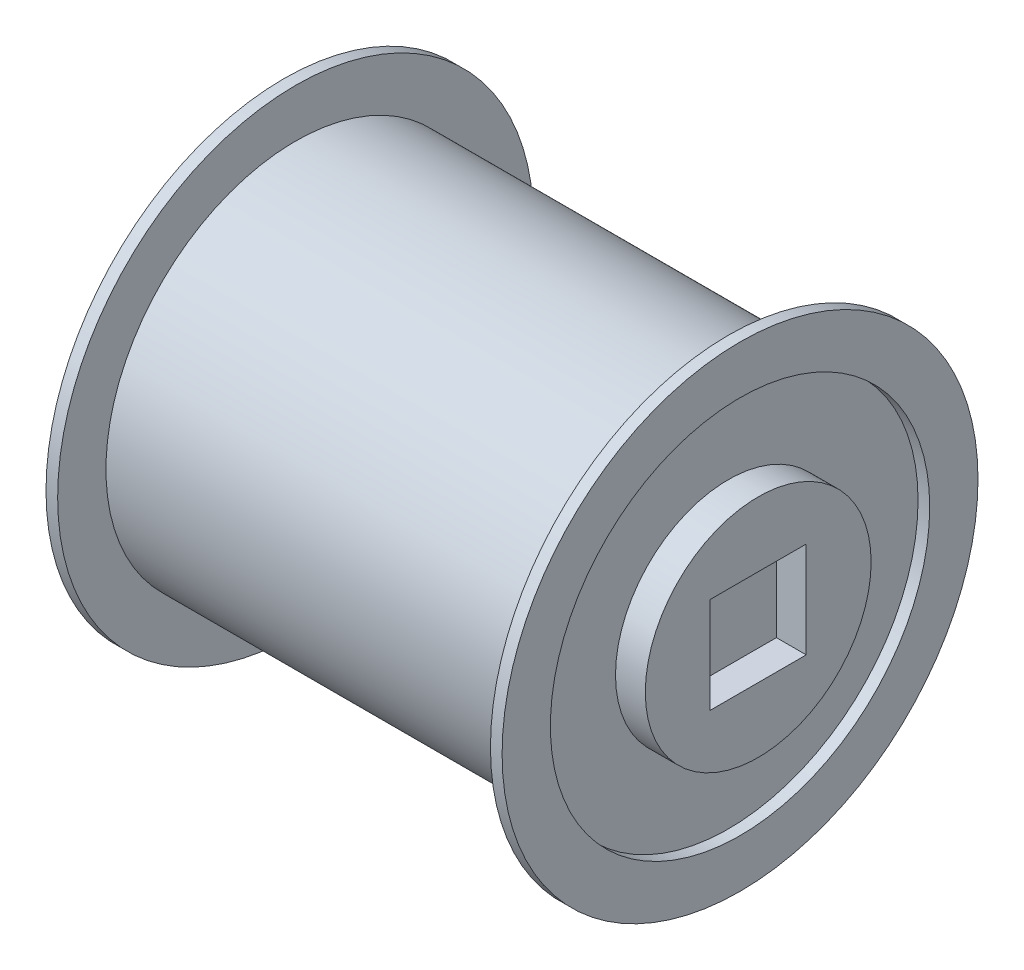
ISO-10303-21;
HEADER;
FILE_DESCRIPTION(('STEP AP214'),'2;1');
FILE_NAME('part.step','',(''),(''),'','','');
FILE_SCHEMA(('AUTOMOTIVE_DESIGN { 1 0 10303 214 1 1 1 1 }'));
ENDSEC;
DATA;
#1=APPLICATION_CONTEXT('core data for automotive mechanical design processes');
#2=APPLICATION_PROTOCOL_DEFINITION('international standard','automotive_design',2000,#1);
#3=PRODUCT_CONTEXT('',#1,'mechanical');
#4=PRODUCT('Part','Part','',(#3));
#5=PRODUCT_RELATED_PRODUCT_CATEGORY('part','',(#4));
#6=PRODUCT_DEFINITION_FORMATION('','',#4);
#7=PRODUCT_DEFINITION_CONTEXT('part definition',#1,'design');
#8=PRODUCT_DEFINITION('design','',#6,#7);
#9=PRODUCT_DEFINITION_SHAPE('','',#8);
#10=(LENGTH_UNIT() NAMED_UNIT(*) SI_UNIT(.MILLI.,.METRE.));
#11=(NAMED_UNIT(*) PLANE_ANGLE_UNIT() SI_UNIT($,.RADIAN.));
#12=(NAMED_UNIT(*) SI_UNIT($,.STERADIAN.) SOLID_ANGLE_UNIT());
#13=UNCERTAINTY_MEASURE_WITH_UNIT(LENGTH_MEASURE(1.E-05),#10,'distance_accuracy_value','');
#14=(GEOMETRIC_REPRESENTATION_CONTEXT(3) GLOBAL_UNCERTAINTY_ASSIGNED_CONTEXT((#13)) GLOBAL_UNIT_ASSIGNED_CONTEXT((#10,
#11,#12)) REPRESENTATION_CONTEXT('',''));
#15=CARTESIAN_POINT('',(0.,0.,0.));
#16=DIRECTION('',(0.,0.,1.));
#17=DIRECTION('',(1.,0.,0.));
#18=AXIS2_PLACEMENT_3D('',#15,#16,#17);
#19=CARTESIAN_POINT('',(37.15,0.,0.));
#20=DIRECTION('',(1.,0.,0.));
#21=DIRECTION('',(0.,0.,-1.));
#22=AXIS2_PLACEMENT_3D('',#19,#20,#21);
#23=CYLINDRICAL_SURFACE('',#22,20.425);
#24=CARTESIAN_POINT('',(37.15,0.,0.));
#25=DIRECTION('',(1.,0.,0.));
#26=DIRECTION('',(0.,0.,-1.));
#27=AXIS2_PLACEMENT_3D('',#24,#25,#26);
#28=CIRCLE('',#27,20.425);
#29=CARTESIAN_POINT('',(37.15,0.,-20.425));
#30=VERTEX_POINT('',#29);
#31=EDGE_CURVE('E12',#30,#30,#28,.T.);
#32=ORIENTED_EDGE('',*,*,#31,.T.);
#33=EDGE_LOOP('',(#32));
#34=FACE_BOUND('',#33,.T.);
#35=CARTESIAN_POINT('',(38.15,0.,0.));
#36=DIRECTION('',(1.,0.,0.));
#37=DIRECTION('',(0.,0.,-1.));
#38=AXIS2_PLACEMENT_3D('',#35,#36,#37);
#39=CIRCLE('',#38,20.425);
#40=CARTESIAN_POINT('',(38.15,0.,-20.425));
#41=VERTEX_POINT('',#40);
#42=EDGE_CURVE('E129',#41,#41,#39,.T.);
#43=ORIENTED_EDGE('',*,*,#42,.F.);
#44=EDGE_LOOP('',(#43));
#45=FACE_BOUND('',#44,.T.);
#46=ADVANCED_FACE('F126',(#34,#45),#23,.T.);
#47=CARTESIAN_POINT('',(37.15,0.,0.));
#48=DIRECTION('',(1.,0.,0.));
#49=DIRECTION('',(0.,0.,-1.));
#50=AXIS2_PLACEMENT_3D('',#47,#48,#49);
#51=PLANE('',#50);
#52=CARTESIAN_POINT('',(37.15,0.,0.));
#53=DIRECTION('',(1.,0.,0.));
#54=DIRECTION('',(0.,0.,-1.));
#55=AXIS2_PLACEMENT_3D('',#52,#53,#54);
#56=CIRCLE('',#55,16.28);
#57=CARTESIAN_POINT('',(37.15,0.,-16.28));
#58=VERTEX_POINT('',#57);
#59=EDGE_CURVE('E136',#58,#58,#56,.T.);
#60=ORIENTED_EDGE('',*,*,#59,.T.);
#61=EDGE_LOOP('',(#60));
#62=FACE_BOUND('',#61,.T.);
#63=ORIENTED_EDGE('',*,*,#31,.F.);
#64=EDGE_LOOP('',(#63));
#65=FACE_BOUND('',#64,.T.);
#66=ADVANCED_FACE('F144',(#62,#65),#51,.F.);
#67=CARTESIAN_POINT('',(38.15,0.,0.));
#68=DIRECTION('',(1.,0.,0.));
#69=DIRECTION('',(0.,0.,-1.));
#70=AXIS2_PLACEMENT_3D('',#67,#68,#69);
#71=PLANE('',#70);
#72=CARTESIAN_POINT('',(38.15,0.,0.));
#73=DIRECTION('',(1.,0.,0.));
#74=DIRECTION('',(0.,0.,-1.));
#75=AXIS2_PLACEMENT_3D('',#72,#73,#74);
#76=CIRCLE('',#75,16.28);
#77=CARTESIAN_POINT('',(38.15,0.,-16.28));
#78=VERTEX_POINT('',#77);
#79=EDGE_CURVE('E138',#78,#78,#76,.T.);
#80=ORIENTED_EDGE('',*,*,#79,.F.);
#81=EDGE_LOOP('',(#80));
#82=FACE_BOUND('',#81,.T.);
#83=ORIENTED_EDGE('',*,*,#42,.T.);
#84=EDGE_LOOP('',(#83));
#85=FACE_BOUND('',#84,.T.);
#86=ADVANCED_FACE('F150',(#82,#85),#71,.T.);
#87=CARTESIAN_POINT('',(37.15,0.,0.));
#88=DIRECTION('',(1.,0.,0.));
#89=DIRECTION('',(0.,0.,-1.));
#90=AXIS2_PLACEMENT_3D('',#87,#88,#89);
#91=CYLINDRICAL_SURFACE('',#90,16.28);
#92=ORIENTED_EDGE('',*,*,#59,.F.);
#93=EDGE_LOOP('',(#92));
#94=FACE_BOUND('',#93,.T.);
#95=ORIENTED_EDGE('',*,*,#79,.T.);
#96=EDGE_LOOP('',(#95));
#97=FACE_BOUND('',#96,.T.);
#98=ADVANCED_FACE('F147',(#94,#97),#91,.F.);
#99=CLOSED_SHELL('',(#46,#66,#86,#98));
#100=MANIFOLD_SOLID_BREP('B2',#99);
#101=CARTESIAN_POINT('',(-1.,0.,0.));
#102=DIRECTION('',(1.,0.,0.));
#103=DIRECTION('',(0.,0.,-1.));
#104=AXIS2_PLACEMENT_3D('',#101,#102,#103);
#105=CYLINDRICAL_SURFACE('',#104,20.425);
#106=CARTESIAN_POINT('',(-1.,0.,0.));
#107=DIRECTION('',(1.,0.,0.));
#108=DIRECTION('',(0.,0.,-1.));
#109=AXIS2_PLACEMENT_3D('',#106,#107,#108);
#110=CIRCLE('',#109,20.425);
#111=CARTESIAN_POINT('',(-1.,0.,-20.425));
#112=VERTEX_POINT('',#111);
#113=EDGE_CURVE('E125',#112,#112,#110,.T.);
#114=ORIENTED_EDGE('',*,*,#113,.T.);
#115=EDGE_LOOP('',(#114));
#116=FACE_BOUND('',#115,.T.);
#117=CARTESIAN_POINT('',(0.,0.,0.));
#118=DIRECTION('',(1.,0.,0.));
#119=DIRECTION('',(0.,0.,-1.));
#120=AXIS2_PLACEMENT_3D('',#117,#118,#119);
#121=CIRCLE('',#120,20.425);
#122=CARTESIAN_POINT('',(0.,0.,-20.425));
#123=VERTEX_POINT('',#122);
#124=EDGE_CURVE('E200',#123,#123,#121,.T.);
#125=ORIENTED_EDGE('',*,*,#124,.F.);
#126=EDGE_LOOP('',(#125));
#127=FACE_BOUND('',#126,.T.);
#128=ADVANCED_FACE('F197',(#116,#127),#105,.T.);
#129=CARTESIAN_POINT('',(-1.,0.,0.));
#130=DIRECTION('',(1.,0.,0.));
#131=DIRECTION('',(0.,0.,-1.));
#132=AXIS2_PLACEMENT_3D('',#129,#130,#131);
#133=PLANE('',#132);
#134=CARTESIAN_POINT('',(-1.,0.,0.));
#135=DIRECTION('',(1.,0.,0.));
#136=DIRECTION('',(0.,0.,-1.));
#137=AXIS2_PLACEMENT_3D('',#134,#135,#136);
#138=CIRCLE('',#137,16.28);
#139=CARTESIAN_POINT('',(-1.,0.,-16.28));
#140=VERTEX_POINT('',#139);
#141=EDGE_CURVE('E207',#140,#140,#138,.T.);
#142=ORIENTED_EDGE('',*,*,#141,.T.);
#143=EDGE_LOOP('',(#142));
#144=FACE_BOUND('',#143,.T.);
#145=ORIENTED_EDGE('',*,*,#113,.F.);
#146=EDGE_LOOP('',(#145));
#147=FACE_BOUND('',#146,.T.);
#148=ADVANCED_FACE('F215',(#144,#147),#133,.F.);
#149=CARTESIAN_POINT('',(0.,0.,0.));
#150=DIRECTION('',(1.,0.,0.));
#151=DIRECTION('',(0.,0.,-1.));
#152=AXIS2_PLACEMENT_3D('',#149,#150,#151);
#153=PLANE('',#152);
#154=CARTESIAN_POINT('',(0.,0.,0.));
#155=DIRECTION('',(1.,0.,0.));
#156=DIRECTION('',(0.,0.,-1.));
#157=AXIS2_PLACEMENT_3D('',#154,#155,#156);
#158=CIRCLE('',#157,16.28);
#159=CARTESIAN_POINT('',(0.,0.,-16.28));
#160=VERTEX_POINT('',#159);
#161=EDGE_CURVE('E209',#160,#160,#158,.T.);
#162=ORIENTED_EDGE('',*,*,#161,.F.);
#163=EDGE_LOOP('',(#162));
#164=FACE_BOUND('',#163,.T.);
#165=ORIENTED_EDGE('',*,*,#124,.T.);
#166=EDGE_LOOP('',(#165));
#167=FACE_BOUND('',#166,.T.);
#168=ADVANCED_FACE('F221',(#164,#167),#153,.T.);
#169=CARTESIAN_POINT('',(-1.,0.,0.));
#170=DIRECTION('',(1.,0.,0.));
#171=DIRECTION('',(0.,0.,-1.));
#172=AXIS2_PLACEMENT_3D('',#169,#170,#171);
#173=CYLINDRICAL_SURFACE('',#172,16.28);
#174=ORIENTED_EDGE('',*,*,#141,.F.);
#175=EDGE_LOOP('',(#174));
#176=FACE_BOUND('',#175,.T.);
#177=ORIENTED_EDGE('',*,*,#161,.T.);
#178=EDGE_LOOP('',(#177));
#179=FACE_BOUND('',#178,.T.);
#180=ADVANCED_FACE('F218',(#176,#179),#173,.F.);
#181=CLOSED_SHELL('',(#128,#148,#168,#180));
#182=MANIFOLD_SOLID_BREP('B7',#181);
#183=CARTESIAN_POINT('',(39.71,4.12030856,-4.12030856));
#184=DIRECTION('',(0.,-1.,0.));
#185=DIRECTION('',(0.,0.,-1.));
#186=AXIS2_PLACEMENT_3D('',#183,#184,#185);
#187=PLANE('',#186);
#188=DIRECTION('',(-1.,0.,0.));
#189=VECTOR('',#188,1.);
#190=CARTESIAN_POINT('',(39.71,4.12030856,4.12030856));
#191=LINE('',#190,#189);
#192=CARTESIAN_POINT('',(39.71,4.12030856,4.12030856));
#193=VERTEX_POINT('',#192);
#194=CARTESIAN_POINT('',(37.15,4.12030856,4.12030856));
#195=VERTEX_POINT('',#194);
#196=EDGE_CURVE('E343',#193,#195,#191,.T.);
#197=ORIENTED_EDGE('',*,*,#196,.T.);
#198=DIRECTION('',(0.,0.,1.));
#199=VECTOR('',#198,1.);
#200=CARTESIAN_POINT('',(37.15,4.12030856,-4.12030856));
#201=LINE('',#200,#199);
#202=CARTESIAN_POINT('',(37.15,4.12030856,-4.12030856));
#203=VERTEX_POINT('',#202);
#204=EDGE_CURVE('E342',#203,#195,#201,.T.);
#205=ORIENTED_EDGE('',*,*,#204,.F.);
#206=DIRECTION('',(-1.,0.,0.));
#207=VECTOR('',#206,1.);
#208=CARTESIAN_POINT('',(39.71,4.12030856,-4.12030856));
#209=LINE('',#208,#207);
#210=CARTESIAN_POINT('',(39.71,4.12030856,-4.12030856));
#211=VERTEX_POINT('',#210);
#212=EDGE_CURVE('E327',#211,#203,#209,.T.);
#213=ORIENTED_EDGE('',*,*,#212,.F.);
#214=DIRECTION('',(0.,0.,1.));
#215=VECTOR('',#214,1.);
#216=CARTESIAN_POINT('',(39.71,4.12030856,-4.12030856));
#217=LINE('',#216,#215);
#218=EDGE_CURVE('E392',#211,#193,#217,.T.);
#219=ORIENTED_EDGE('',*,*,#218,.T.);
#220=EDGE_LOOP('',(#197,#205,#213,#219));
#221=FACE_BOUND('',#220,.T.);
#222=ADVANCED_FACE('F259',(#221),#187,.T.);
#223=CARTESIAN_POINT('',(39.71,4.12030856,4.12030856));
#224=DIRECTION('',(0.,0.,-1.));
#225=DIRECTION('',(-1.,0.,0.));
#226=AXIS2_PLACEMENT_3D('',#223,#224,#225);
#227=PLANE('',#226);
#228=DIRECTION('',(-1.,0.,0.));
#229=VECTOR('',#228,1.);
#230=CARTESIAN_POINT('',(39.71,-4.12030856,4.12030856));
#231=LINE('',#230,#229);
#232=CARTESIAN_POINT('',(39.71,-4.12030856,4.12030856));
#233=VERTEX_POINT('',#232);
#234=CARTESIAN_POINT('',(37.15,-4.12030856,4.12030856));
#235=VERTEX_POINT('',#234);
#236=EDGE_CURVE('E408',#233,#235,#231,.T.);
#237=ORIENTED_EDGE('',*,*,#236,.T.);
#238=DIRECTION('',(0.,-1.,0.));
#239=VECTOR('',#238,1.);
#240=CARTESIAN_POINT('',(37.15,4.12030856,4.12030856));
#241=LINE('',#240,#239);
#242=EDGE_CURVE('E275',#195,#235,#241,.T.);
#243=ORIENTED_EDGE('',*,*,#242,.F.);
#244=ORIENTED_EDGE('',*,*,#196,.F.);
#245=DIRECTION('',(0.,-1.,0.));
#246=VECTOR('',#245,1.);
#247=CARTESIAN_POINT('',(39.71,4.12030856,4.12030856));
#248=LINE('',#247,#246);
#249=EDGE_CURVE('E395',#193,#233,#248,.T.);
#250=ORIENTED_EDGE('',*,*,#249,.T.);
#251=EDGE_LOOP('',(#237,#243,#244,#250));
#252=FACE_BOUND('',#251,.T.);
#253=ADVANCED_FACE('F434',(#252),#227,.T.);
#254=CARTESIAN_POINT('',(39.71,-4.12030856,-4.12030856));
#255=DIRECTION('',(0.,-1.,0.));
#256=DIRECTION('',(0.,0.,-1.));
#257=AXIS2_PLACEMENT_3D('',#254,#255,#256);
#258=PLANE('',#257);
#259=DIRECTION('',(0.,0.,1.));
#260=VECTOR('',#259,1.);
#261=CARTESIAN_POINT('',(37.15,-4.12030856,-4.12030856));
#262=LINE('',#261,#260);
#263=CARTESIAN_POINT('',(37.15,-4.12030856,-4.12030856));
#264=VERTEX_POINT('',#263);
#265=EDGE_CURVE('E283',#264,#235,#262,.T.);
#266=ORIENTED_EDGE('',*,*,#265,.T.);
#267=ORIENTED_EDGE('',*,*,#236,.F.);
#268=DIRECTION('',(0.,0.,1.));
#269=VECTOR('',#268,1.);
#270=CARTESIAN_POINT('',(39.71,-4.12030856,-4.12030856));
#271=LINE('',#270,#269);
#272=CARTESIAN_POINT('',(39.71,-4.12030856,-4.12030856));
#273=VERTEX_POINT('',#272);
#274=EDGE_CURVE('E398',#273,#233,#271,.T.);
#275=ORIENTED_EDGE('',*,*,#274,.F.);
#276=DIRECTION('',(-1.,0.,0.));
#277=VECTOR('',#276,1.);
#278=CARTESIAN_POINT('',(39.71,-4.12030856,-4.12030856));
#279=LINE('',#278,#277);
#280=EDGE_CURVE('E404',#273,#264,#279,.T.);
#281=ORIENTED_EDGE('',*,*,#280,.T.);
#282=EDGE_LOOP('',(#266,#267,#275,#281));
#283=FACE_BOUND('',#282,.T.);
#284=ADVANCED_FACE('F440',(#283),#258,.F.);
#285=CARTESIAN_POINT('',(39.71,4.12030856,-4.12030856));
#286=DIRECTION('',(0.,0.,-1.));
#287=DIRECTION('',(-1.,0.,0.));
#288=AXIS2_PLACEMENT_3D('',#285,#286,#287);
#289=PLANE('',#288);
#290=DIRECTION('',(0.,-1.,0.));
#291=VECTOR('',#290,1.);
#292=CARTESIAN_POINT('',(37.15,4.12030856,-4.12030856));
#293=LINE('',#292,#291);
#294=EDGE_CURVE('E332',#203,#264,#293,.T.);
#295=ORIENTED_EDGE('',*,*,#294,.T.);
#296=ORIENTED_EDGE('',*,*,#280,.F.);
#297=DIRECTION('',(0.,-1.,0.));
#298=VECTOR('',#297,1.);
#299=CARTESIAN_POINT('',(39.71,4.12030856,-4.12030856));
#300=LINE('',#299,#298);
#301=EDGE_CURVE('E334',#211,#273,#300,.T.);
#302=ORIENTED_EDGE('',*,*,#301,.F.);
#303=ORIENTED_EDGE('',*,*,#212,.T.);
#304=EDGE_LOOP('',(#295,#296,#302,#303));
#305=FACE_BOUND('',#304,.T.);
#306=ADVANCED_FACE('F329',(#305),#289,.F.);
#307=CARTESIAN_POINT('',(39.71,0.,0.));
#308=DIRECTION('',(1.,0.,0.));
#309=DIRECTION('',(0.,0.,-1.));
#310=AXIS2_PLACEMENT_3D('',#307,#308,#309);
#311=PLANE('',#310);
#312=CARTESIAN_POINT('',(39.71,0.,0.));
#313=DIRECTION('',(1.,0.,0.));
#314=DIRECTION('',(0.,0.,-1.));
#315=AXIS2_PLACEMENT_3D('',#312,#313,#314);
#316=CIRCLE('',#315,9.69220282288941);
#317=CARTESIAN_POINT('',(39.71,0.,-9.69220282288941));
#318=VERTEX_POINT('',#317);
#319=EDGE_CURVE('E268',#318,#318,#316,.T.);
#320=ORIENTED_EDGE('',*,*,#319,.T.);
#321=EDGE_LOOP('',(#320));
#322=FACE_BOUND('',#321,.T.);
#323=ORIENTED_EDGE('',*,*,#249,.F.);
#324=ORIENTED_EDGE('',*,*,#218,.F.);
#325=ORIENTED_EDGE('',*,*,#301,.T.);
#326=ORIENTED_EDGE('',*,*,#274,.T.);
#327=EDGE_LOOP('',(#323,#324,#325,#326));
#328=FACE_BOUND('',#327,.T.);
#329=ADVANCED_FACE('F417',(#322,#328),#311,.T.);
#330=CARTESIAN_POINT('',(39.71,0.,0.));
#331=DIRECTION('',(-1.,0.,0.));
#332=DIRECTION('',(0.,0.,1.));
#333=AXIS2_PLACEMENT_3D('',#330,#331,#332);
#334=CYLINDRICAL_SURFACE('',#333,9.69220282288941);
#335=CARTESIAN_POINT('',(37.15,0.,0.));
#336=DIRECTION('',(1.,0.,0.));
#337=DIRECTION('',(0.,0.,-1.));
#338=AXIS2_PLACEMENT_3D('',#335,#336,#337);
#339=CIRCLE('',#338,9.69220282288941);
#340=CARTESIAN_POINT('',(37.15,0.,-9.69220282288941));
#341=VERTEX_POINT('',#340);
#342=EDGE_CURVE('E359',#341,#341,#339,.T.);
#343=ORIENTED_EDGE('',*,*,#342,.T.);
#344=EDGE_LOOP('',(#343));
#345=FACE_BOUND('',#344,.T.);
#346=ORIENTED_EDGE('',*,*,#319,.F.);
#347=EDGE_LOOP('',(#346));
#348=FACE_BOUND('',#347,.T.);
#349=ADVANCED_FACE('F261',(#345,#348),#334,.T.);
#350=CARTESIAN_POINT('',(37.15,0.,0.));
#351=DIRECTION('',(-1.,0.,0.));
#352=DIRECTION('',(0.,0.,1.));
#353=AXIS2_PLACEMENT_3D('',#350,#351,#352);
#354=PLANE('',#353);
#355=ORIENTED_EDGE('',*,*,#294,.F.);
#356=ORIENTED_EDGE('',*,*,#204,.T.);
#357=ORIENTED_EDGE('',*,*,#242,.T.);
#358=ORIENTED_EDGE('',*,*,#265,.F.);
#359=EDGE_LOOP('',(#355,#356,#357,#358));
#360=FACE_BOUND('',#359,.T.);
#361=ADVANCED_FACE('F348',(#360),#354,.F.);
#362=CARTESIAN_POINT('',(37.15,0.,0.));
#363=DIRECTION('',(1.,0.,0.));
#364=DIRECTION('',(0.,0.,-1.));
#365=AXIS2_PLACEMENT_3D('',#362,#363,#364);
#366=PLANE('',#365);
#367=CARTESIAN_POINT('',(37.15,0.,0.));
#368=DIRECTION('',(1.,0.,0.));
#369=DIRECTION('',(0.,0.,-1.));
#370=AXIS2_PLACEMENT_3D('',#367,#368,#369);
#371=CIRCLE('',#370,16.28);
#372=CARTESIAN_POINT('',(37.15,0.,-16.28));
#373=VERTEX_POINT('',#372);
#374=EDGE_CURVE('E591',#373,#373,#371,.T.);
#375=ORIENTED_EDGE('',*,*,#374,.T.);
#376=EDGE_LOOP('',(#375));
#377=FACE_BOUND('',#376,.T.);
#378=ORIENTED_EDGE('',*,*,#342,.F.);
#379=EDGE_LOOP('',(#378));
#380=FACE_BOUND('',#379,.T.);
#381=ADVANCED_FACE('F427',(#377,#380),#366,.T.);
#382=CARTESIAN_POINT('',(0.,0.,0.));
#383=DIRECTION('',(1.,0.,0.));
#384=DIRECTION('',(0.,0.,-1.));
#385=AXIS2_PLACEMENT_3D('',#382,#383,#384);
#386=PLANE('',#385);
#387=CARTESIAN_POINT('',(0.,0.,0.));
#388=DIRECTION('',(1.,0.,0.));
#389=DIRECTION('',(0.,0.,-1.));
#390=AXIS2_PLACEMENT_3D('',#387,#388,#389);
#391=CIRCLE('',#390,16.28);
#392=CARTESIAN_POINT('',(0.,0.,-16.28));
#393=VERTEX_POINT('',#392);
#394=EDGE_CURVE('E594',#393,#393,#391,.T.);
#395=ORIENTED_EDGE('',*,*,#394,.F.);
#396=EDGE_LOOP('',(#395));
#397=FACE_BOUND('',#396,.T.);
#398=CARTESIAN_POINT('',(0.,0.,0.));
#399=DIRECTION('',(1.,0.,0.));
#400=DIRECTION('',(0.,0.,-1.));
#401=AXIS2_PLACEMENT_3D('',#398,#399,#400);
#402=CIRCLE('',#401,9.69220282288941);
#403=CARTESIAN_POINT('',(0.,0.,-9.69220282288941));
#404=VERTEX_POINT('',#403);
#405=EDGE_CURVE('E195',#404,#404,#402,.T.);
#406=ORIENTED_EDGE('',*,*,#405,.T.);
#407=EDGE_LOOP('',(#406));
#408=FACE_BOUND('',#407,.T.);
#409=ADVANCED_FACE('F481',(#397,#408),#386,.F.);
#410=CARTESIAN_POINT('',(37.15,0.,0.));
#411=DIRECTION('',(-1.,0.,0.));
#412=DIRECTION('',(0.,0.,1.));
#413=AXIS2_PLACEMENT_3D('',#410,#411,#412);
#414=CYLINDRICAL_SURFACE('',#413,16.28);
#415=ORIENTED_EDGE('',*,*,#374,.F.);
#416=EDGE_LOOP('',(#415));
#417=FACE_BOUND('',#416,.T.);
#418=ORIENTED_EDGE('',*,*,#394,.T.);
#419=EDGE_LOOP('',(#418));
#420=FACE_BOUND('',#419,.T.);
#421=ADVANCED_FACE('F474',(#417,#420),#414,.T.);
#422=CARTESIAN_POINT('',(0.,0.,0.));
#423=DIRECTION('',(-1.,0.,0.));
#424=DIRECTION('',(0.,0.,1.));
#425=AXIS2_PLACEMENT_3D('',#422,#423,#424);
#426=PLANE('',#425);
#427=DIRECTION('',(0.,-1.,0.));
#428=VECTOR('',#427,1.);
#429=CARTESIAN_POINT('',(0.,4.12030856,-4.12030856));
#430=LINE('',#429,#428);
#431=CARTESIAN_POINT('',(0.,4.12030856,-4.12030856));
#432=VERTEX_POINT('',#431);
#433=CARTESIAN_POINT('',(0.,-4.12030856,-4.12030856));
#434=VERTEX_POINT('',#433);
#435=EDGE_CURVE('E364',#432,#434,#430,.T.);
#436=ORIENTED_EDGE('',*,*,#435,.T.);
#437=DIRECTION('',(0.,0.,1.));
#438=VECTOR('',#437,1.);
#439=CARTESIAN_POINT('',(0.,-4.12030856,-4.12030856));
#440=LINE('',#439,#438);
#441=CARTESIAN_POINT('',(0.,-4.12030856,4.12030856));
#442=VERTEX_POINT('',#441);
#443=EDGE_CURVE('E367',#434,#442,#440,.T.);
#444=ORIENTED_EDGE('',*,*,#443,.T.);
#445=DIRECTION('',(0.,-1.,0.));
#446=VECTOR('',#445,1.);
#447=CARTESIAN_POINT('',(0.,4.12030856,4.12030856));
#448=LINE('',#447,#446);
#449=CARTESIAN_POINT('',(0.,4.12030856,4.12030856));
#450=VERTEX_POINT('',#449);
#451=EDGE_CURVE('E356',#450,#442,#448,.T.);
#452=ORIENTED_EDGE('',*,*,#451,.F.);
#453=DIRECTION('',(0.,0.,1.));
#454=VECTOR('',#453,1.);
#455=CARTESIAN_POINT('',(0.,4.12030856,-4.12030856));
#456=LINE('',#455,#454);
#457=EDGE_CURVE('E350',#432,#450,#456,.T.);
#458=ORIENTED_EDGE('',*,*,#457,.F.);
#459=EDGE_LOOP('',(#436,#444,#452,#458));
#460=FACE_BOUND('',#459,.T.);
#461=ADVANCED_FACE('F472',(#460),#426,.T.);
#462=CARTESIAN_POINT('',(-2.56,-4.12030856,4.12030856));
#463=VERTEX_POINT('',#462);
#464=EDGE_CURVE('E407',#442,#463,#231,.T.);
#465=ORIENTED_EDGE('',*,*,#464,.F.);
#466=ORIENTED_EDGE('',*,*,#443,.F.);
#467=CARTESIAN_POINT('',(-2.56,-4.12030856,-4.12030856));
#468=VERTEX_POINT('',#467);
#469=EDGE_CURVE('E338',#434,#468,#279,.T.);
#470=ORIENTED_EDGE('',*,*,#469,.T.);
#471=DIRECTION('',(0.,0.,1.));
#472=VECTOR('',#471,1.);
#473=CARTESIAN_POINT('',(-2.56,-4.12030856,-4.12030856));
#474=LINE('',#473,#472);
#475=EDGE_CURVE('E380',#468,#463,#474,.T.);
#476=ORIENTED_EDGE('',*,*,#475,.T.);
#477=EDGE_LOOP('',(#465,#466,#470,#476));
#478=FACE_BOUND('',#477,.T.);
#479=ADVANCED_FACE('F452',(#478),#258,.F.);
#480=ORIENTED_EDGE('',*,*,#451,.T.);
#481=ORIENTED_EDGE('',*,*,#464,.T.);
#482=DIRECTION('',(0.,-1.,0.));
#483=VECTOR('',#482,1.);
#484=CARTESIAN_POINT('',(-2.56,4.12030856,4.12030856));
#485=LINE('',#484,#483);
#486=CARTESIAN_POINT('',(-2.56,4.12030856,4.12030856));
#487=VERTEX_POINT('',#486);
#488=EDGE_CURVE('E376',#487,#463,#485,.T.);
#489=ORIENTED_EDGE('',*,*,#488,.F.);
#490=EDGE_CURVE('E411',#450,#487,#191,.T.);
#491=ORIENTED_EDGE('',*,*,#490,.F.);
#492=EDGE_LOOP('',(#480,#481,#489,#491));
#493=FACE_BOUND('',#492,.T.);
#494=ADVANCED_FACE('F442',(#493),#227,.T.);
#495=ORIENTED_EDGE('',*,*,#457,.T.);
#496=ORIENTED_EDGE('',*,*,#490,.T.);
#497=DIRECTION('',(0.,0.,1.));
#498=VECTOR('',#497,1.);
#499=CARTESIAN_POINT('',(-2.56,4.12030856,-4.12030856));
#500=LINE('',#499,#498);
#501=CARTESIAN_POINT('',(-2.56,4.12030856,-4.12030856));
#502=VERTEX_POINT('',#501);
#503=EDGE_CURVE('E346',#502,#487,#500,.T.);
#504=ORIENTED_EDGE('',*,*,#503,.F.);
#505=EDGE_CURVE('E339',#432,#502,#209,.T.);
#506=ORIENTED_EDGE('',*,*,#505,.F.);
#507=EDGE_LOOP('',(#495,#496,#504,#506));
#508=FACE_BOUND('',#507,.T.);
#509=ADVANCED_FACE('F436',(#508),#187,.T.);
#510=ORIENTED_EDGE('',*,*,#469,.F.);
#511=ORIENTED_EDGE('',*,*,#435,.F.);
#512=ORIENTED_EDGE('',*,*,#505,.T.);
#513=DIRECTION('',(0.,-1.,0.));
#514=VECTOR('',#513,1.);
#515=CARTESIAN_POINT('',(-2.56,4.12030856,-4.12030856));
#516=LINE('',#515,#514);
#517=EDGE_CURVE('E384',#502,#468,#516,.T.);
#518=ORIENTED_EDGE('',*,*,#517,.T.);
#519=EDGE_LOOP('',(#510,#511,#512,#518));
#520=FACE_BOUND('',#519,.T.);
#521=ADVANCED_FACE('F444',(#520),#289,.F.);
#522=CARTESIAN_POINT('',(-2.56,0.,0.));
#523=DIRECTION('',(1.,0.,0.));
#524=DIRECTION('',(0.,0.,-1.));
#525=AXIS2_PLACEMENT_3D('',#522,#523,#524);
#526=PLANE('',#525);
#527=ORIENTED_EDGE('',*,*,#517,.F.);
#528=ORIENTED_EDGE('',*,*,#503,.T.);
#529=ORIENTED_EDGE('',*,*,#488,.T.);
#530=ORIENTED_EDGE('',*,*,#475,.F.);
#531=EDGE_LOOP('',(#527,#528,#529,#530));
#532=FACE_BOUND('',#531,.T.);
#533=CARTESIAN_POINT('',(-2.56,0.,0.));
#534=DIRECTION('',(1.,0.,0.));
#535=DIRECTION('',(0.,0.,-1.));
#536=AXIS2_PLACEMENT_3D('',#533,#534,#535);
#537=CIRCLE('',#536,9.69220282288941);
#538=CARTESIAN_POINT('',(-2.56,0.,-9.69220282288941));
#539=VERTEX_POINT('',#538);
#540=EDGE_CURVE('E388',#539,#539,#537,.T.);
#541=ORIENTED_EDGE('',*,*,#540,.F.);
#542=EDGE_LOOP('',(#541));
#543=FACE_BOUND('',#542,.T.);
#544=ADVANCED_FACE('F431',(#532,#543),#526,.F.);
#545=ORIENTED_EDGE('',*,*,#540,.T.);
#546=EDGE_LOOP('',(#545));
#547=FACE_BOUND('',#546,.T.);
#548=ORIENTED_EDGE('',*,*,#405,.F.);
#549=EDGE_LOOP('',(#548));
#550=FACE_BOUND('',#549,.T.);
#551=ADVANCED_FACE('F422',(#547,#550),#334,.T.);
#552=CLOSED_SHELL('',(#222,#253,#284,#306,#329,#349,#361,#381,#409,#421,#461,#479,#494,#509,
#521,#544,#551));
#553=MANIFOLD_SOLID_BREP('B120',#552);
#554=ADVANCED_BREP_SHAPE_REPRESENTATION('',(#18,#100,#182,#553),#14);
#555=SHAPE_DEFINITION_REPRESENTATION(#9,#554);
ENDSEC;
END-ISO-10303-21;
